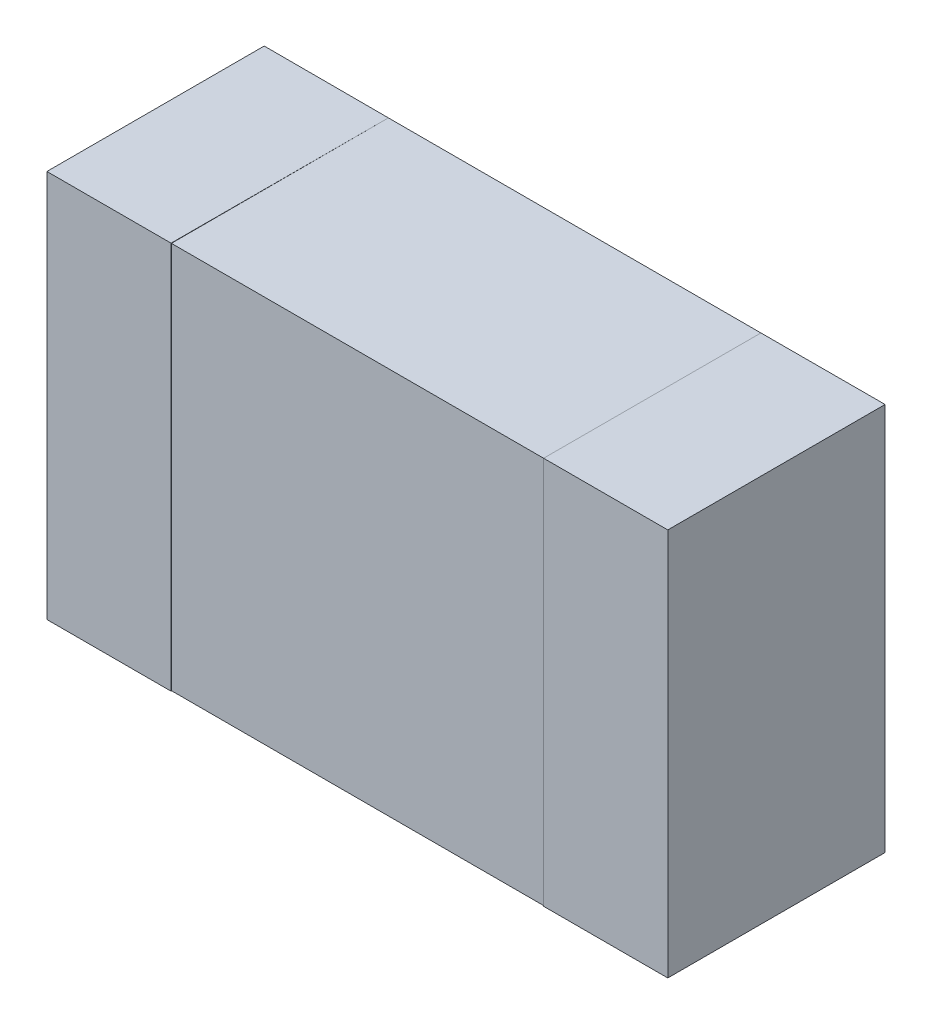
ISO-10303-21;
HEADER;
FILE_DESCRIPTION(('STEP AP214'),'2;1');
FILE_NAME('part.step','',(''),(''),'','','');
FILE_SCHEMA(('AUTOMOTIVE_DESIGN { 1 0 10303 214 1 1 1 1 }'));
ENDSEC;
DATA;
#1=APPLICATION_CONTEXT('core data for automotive mechanical design processes');
#2=APPLICATION_PROTOCOL_DEFINITION('international standard','automotive_design',2000,#1);
#3=PRODUCT_CONTEXT('',#1,'mechanical');
#4=PRODUCT('Part','Part','',(#3));
#5=PRODUCT_RELATED_PRODUCT_CATEGORY('part','',(#4));
#6=PRODUCT_DEFINITION_FORMATION('','',#4);
#7=PRODUCT_DEFINITION_CONTEXT('part definition',#1,'design');
#8=PRODUCT_DEFINITION('design','',#6,#7);
#9=PRODUCT_DEFINITION_SHAPE('','',#8);
#10=(LENGTH_UNIT() NAMED_UNIT(*) SI_UNIT(.MILLI.,.METRE.));
#11=(NAMED_UNIT(*) PLANE_ANGLE_UNIT() SI_UNIT($,.RADIAN.));
#12=(NAMED_UNIT(*) SI_UNIT($,.STERADIAN.) SOLID_ANGLE_UNIT());
#13=UNCERTAINTY_MEASURE_WITH_UNIT(LENGTH_MEASURE(1.E-05),#10,'distance_accuracy_value','');
#14=(GEOMETRIC_REPRESENTATION_CONTEXT(3) GLOBAL_UNCERTAINTY_ASSIGNED_CONTEXT((#13)) GLOBAL_UNIT_ASSIGNED_CONTEXT((#10,
#11,#12)) REPRESENTATION_CONTEXT('',''));
#15=CARTESIAN_POINT('',(0.,0.,0.));
#16=DIRECTION('',(0.,0.,1.));
#17=DIRECTION('',(1.,0.,0.));
#18=AXIS2_PLACEMENT_3D('',#15,#16,#17);
#19=CARTESIAN_POINT('',(0.599,-0.626,0.7));
#20=DIRECTION('',(0.,0.,1.));
#21=DIRECTION('',(1.,0.,0.));
#22=AXIS2_PLACEMENT_3D('',#19,#20,#21);
#23=PLANE('',#22);
#24=DIRECTION('',(0.,-1.,0.));
#25=VECTOR('',#24,1.);
#26=CARTESIAN_POINT('',(1.,0.,0.7));
#27=LINE('',#26,#25);
#28=CARTESIAN_POINT('',(1.,0.625,0.7));
#29=VERTEX_POINT('',#28);
#30=CARTESIAN_POINT('',(1.,-0.625,0.7));
#31=VERTEX_POINT('',#30);
#32=EDGE_CURVE('E179',#29,#31,#27,.T.);
#33=ORIENTED_EDGE('',*,*,#32,.F.);
#34=DIRECTION('',(1.,0.,0.));
#35=VECTOR('',#34,1.);
#36=CARTESIAN_POINT('',(0.8,0.625,0.7));
#37=LINE('',#36,#35);
#38=CARTESIAN_POINT('',(0.6,0.625,0.7));
#39=VERTEX_POINT('',#38);
#40=EDGE_CURVE('E180',#39,#29,#37,.T.);
#41=ORIENTED_EDGE('',*,*,#40,.F.);
#42=DIRECTION('',(0.,1.,0.));
#43=VECTOR('',#42,1.);
#44=CARTESIAN_POINT('',(0.6,-0.626,0.7));
#45=LINE('',#44,#43);
#46=CARTESIAN_POINT('',(0.6,-0.625,0.7));
#47=VERTEX_POINT('',#46);
#48=EDGE_CURVE('E21',#47,#39,#45,.T.);
#49=ORIENTED_EDGE('',*,*,#48,.F.);
#50=DIRECTION('',(-1.,0.,0.));
#51=VECTOR('',#50,1.);
#52=CARTESIAN_POINT('',(0.8,-0.625,0.7));
#53=LINE('',#52,#51);
#54=EDGE_CURVE('E185',#31,#47,#53,.T.);
#55=ORIENTED_EDGE('',*,*,#54,.F.);
#56=EDGE_LOOP('',(#33,#41,#49,#55));
#57=FACE_BOUND('',#56,.T.);
#58=ADVANCED_FACE('F17',(#57),#23,.T.);
#59=CARTESIAN_POINT('',(0.6,-0.626,-0.00100000000000003));
#60=DIRECTION('',(-1.,0.,0.));
#61=DIRECTION('',(0.,0.,1.));
#62=AXIS2_PLACEMENT_3D('',#59,#60,#61);
#63=PLANE('',#62);
#64=DIRECTION('',(0.,0.,-1.));
#65=VECTOR('',#64,1.);
#66=CARTESIAN_POINT('',(0.6,-0.625,0.701));
#67=LINE('',#66,#65);
#68=CARTESIAN_POINT('',(0.6,-0.6245,0.));
#69=VERTEX_POINT('',#68);
#70=EDGE_CURVE('E169',#47,#69,#67,.T.);
#71=ORIENTED_EDGE('',*,*,#70,.F.);
#72=ORIENTED_EDGE('',*,*,#48,.T.);
#73=DIRECTION('',(0.,0.,1.));
#74=VECTOR('',#73,1.);
#75=CARTESIAN_POINT('',(0.6,0.625,-0.00100000000000003));
#76=LINE('',#75,#74);
#77=CARTESIAN_POINT('',(0.6,0.6245,0.));
#78=VERTEX_POINT('',#77);
#79=EDGE_CURVE('E192',#78,#39,#76,.T.);
#80=ORIENTED_EDGE('',*,*,#79,.F.);
#81=DIRECTION('',(0.,0.,1.));
#82=VECTOR('',#81,1.);
#83=CARTESIAN_POINT('',(0.6,0.624,-0.00100000000000003));
#84=LINE('',#83,#82);
#85=CARTESIAN_POINT('',(0.6,0.624,0.699));
#86=VERTEX_POINT('',#85);
#87=EDGE_CURVE('E36',#86,#78,#84,.F.);
#88=ORIENTED_EDGE('',*,*,#87,.F.);
#89=DIRECTION('',(0.,1.,0.));
#90=VECTOR('',#89,1.);
#91=CARTESIAN_POINT('',(0.6,-0.625,0.699));
#92=LINE('',#91,#90);
#93=CARTESIAN_POINT('',(0.6,-0.624,0.699));
#94=VERTEX_POINT('',#93);
#95=EDGE_CURVE('E164',#94,#86,#92,.T.);
#96=ORIENTED_EDGE('',*,*,#95,.F.);
#97=DIRECTION('',(0.,0.,-1.));
#98=VECTOR('',#97,1.);
#99=CARTESIAN_POINT('',(0.6,-0.624,0.7));
#100=LINE('',#99,#98);
#101=EDGE_CURVE('E215',#69,#94,#100,.F.);
#102=ORIENTED_EDGE('',*,*,#101,.F.);
#103=EDGE_LOOP('',(#71,#72,#80,#88,#96,#102));
#104=FACE_BOUND('',#103,.T.);
#105=ADVANCED_FACE('F235',(#104),#63,.T.);
#106=CARTESIAN_POINT('',(0.599,0.625,-0.00100000000000003));
#107=DIRECTION('',(0.,1.,0.));
#108=DIRECTION('',(0.,0.,1.));
#109=AXIS2_PLACEMENT_3D('',#106,#107,#108);
#110=PLANE('',#109);
#111=ORIENTED_EDGE('',*,*,#40,.T.);
#112=DIRECTION('',(0.,0.,1.));
#113=VECTOR('',#112,1.);
#114=CARTESIAN_POINT('',(1.,0.625,0.35));
#115=LINE('',#114,#113);
#116=CARTESIAN_POINT('',(1.,0.625,0.));
#117=VERTEX_POINT('',#116);
#118=EDGE_CURVE('E176',#117,#29,#115,.T.);
#119=ORIENTED_EDGE('',*,*,#118,.F.);
#120=DIRECTION('',(1.,0.,0.));
#121=VECTOR('',#120,1.);
#122=CARTESIAN_POINT('',(0.,0.625,0.));
#123=LINE('',#122,#121);
#124=EDGE_CURVE('E140',#78,#117,#123,.T.);
#125=ORIENTED_EDGE('',*,*,#124,.F.);
#126=ORIENTED_EDGE('',*,*,#79,.T.);
#127=EDGE_LOOP('',(#111,#119,#125,#126));
#128=FACE_BOUND('',#127,.T.);
#129=ADVANCED_FACE('F238',(#128),#110,.T.);
#130=CARTESIAN_POINT('',(1.,-0.626,0.701));
#131=DIRECTION('',(1.,0.,0.));
#132=DIRECTION('',(0.,0.,-1.));
#133=AXIS2_PLACEMENT_3D('',#130,#131,#132);
#134=PLANE('',#133);
#135=ORIENTED_EDGE('',*,*,#32,.T.);
#136=DIRECTION('',(0.,0.,1.));
#137=VECTOR('',#136,1.);
#138=CARTESIAN_POINT('',(1.,-0.625,0.35));
#139=LINE('',#138,#137);
#140=CARTESIAN_POINT('',(1.,-0.625,0.));
#141=VERTEX_POINT('',#140);
#142=EDGE_CURVE('E166',#141,#31,#139,.T.);
#143=ORIENTED_EDGE('',*,*,#142,.F.);
#144=DIRECTION('',(0.,-1.,0.));
#145=VECTOR('',#144,1.);
#146=CARTESIAN_POINT('',(1.,0.,0.));
#147=LINE('',#146,#145);
#148=EDGE_CURVE('E137',#117,#141,#147,.T.);
#149=ORIENTED_EDGE('',*,*,#148,.F.);
#150=ORIENTED_EDGE('',*,*,#118,.T.);
#151=EDGE_LOOP('',(#135,#143,#149,#150));
#152=FACE_BOUND('',#151,.T.);
#153=ADVANCED_FACE('F241',(#152),#134,.T.);
#154=CARTESIAN_POINT('',(0.599,-0.625,0.701));
#155=DIRECTION('',(0.,-1.,0.));
#156=DIRECTION('',(0.,0.,-1.));
#157=AXIS2_PLACEMENT_3D('',#154,#155,#156);
#158=PLANE('',#157);
#159=DIRECTION('',(-1.,0.,0.));
#160=VECTOR('',#159,1.);
#161=CARTESIAN_POINT('',(0.,-0.625,0.));
#162=LINE('',#161,#160);
#163=EDGE_CURVE('E129',#141,#69,#162,.T.);
#164=ORIENTED_EDGE('',*,*,#163,.F.);
#165=ORIENTED_EDGE('',*,*,#142,.T.);
#166=ORIENTED_EDGE('',*,*,#54,.T.);
#167=ORIENTED_EDGE('',*,*,#70,.T.);
#168=EDGE_LOOP('',(#164,#165,#166,#167));
#169=FACE_BOUND('',#168,.T.);
#170=ADVANCED_FACE('F259',(#169),#158,.T.);
#171=CARTESIAN_POINT('',(-0.601,0.624,-0.00100000000000003));
#172=DIRECTION('',(0.,1.,0.));
#173=DIRECTION('',(0.,0.,1.));
#174=AXIS2_PLACEMENT_3D('',#171,#172,#173);
#175=PLANE('',#174);
#176=ORIENTED_EDGE('',*,*,#87,.T.);
#177=DIRECTION('',(1.,0.,0.));
#178=VECTOR('',#177,1.);
#179=CARTESIAN_POINT('',(0.,0.624,0.));
#180=LINE('',#179,#178);
#181=CARTESIAN_POINT('',(-0.6,0.6245,0.));
#182=VERTEX_POINT('',#181);
#183=EDGE_CURVE('E143',#182,#78,#180,.T.);
#184=ORIENTED_EDGE('',*,*,#183,.F.);
#185=DIRECTION('',(0.,0.,-1.));
#186=VECTOR('',#185,1.);
#187=CARTESIAN_POINT('',(-0.6,0.624,0.701));
#188=LINE('',#187,#186);
#189=CARTESIAN_POINT('',(-0.6,0.624,0.699));
#190=VERTEX_POINT('',#189);
#191=EDGE_CURVE('E128',#190,#182,#188,.T.);
#192=ORIENTED_EDGE('',*,*,#191,.F.);
#193=DIRECTION('',(-1.,0.,0.));
#194=VECTOR('',#193,1.);
#195=CARTESIAN_POINT('',(0.,0.624,0.699));
#196=LINE('',#195,#194);
#197=EDGE_CURVE('E161',#86,#190,#196,.T.);
#198=ORIENTED_EDGE('',*,*,#197,.F.);
#199=EDGE_LOOP('',(#176,#184,#192,#198));
#200=FACE_BOUND('',#199,.T.);
#201=ADVANCED_FACE('F247',(#200),#175,.T.);
#202=CARTESIAN_POINT('',(-0.601,-0.624,0.7));
#203=DIRECTION('',(0.,-1.,0.));
#204=DIRECTION('',(0.,0.,-1.));
#205=AXIS2_PLACEMENT_3D('',#202,#203,#204);
#206=PLANE('',#205);
#207=DIRECTION('',(0.,0.,-1.));
#208=VECTOR('',#207,1.);
#209=CARTESIAN_POINT('',(-0.6,-0.624,0.701));
#210=LINE('',#209,#208);
#211=CARTESIAN_POINT('',(-0.6,-0.6245,0.));
#212=VERTEX_POINT('',#211);
#213=CARTESIAN_POINT('',(-0.6,-0.624,0.699));
#214=VERTEX_POINT('',#213);
#215=EDGE_CURVE('E200',#212,#214,#210,.F.);
#216=ORIENTED_EDGE('',*,*,#215,.F.);
#217=DIRECTION('',(-1.,0.,0.));
#218=VECTOR('',#217,1.);
#219=CARTESIAN_POINT('',(0.,-0.624,0.));
#220=LINE('',#219,#218);
#221=EDGE_CURVE('E148',#69,#212,#220,.T.);
#222=ORIENTED_EDGE('',*,*,#221,.F.);
#223=ORIENTED_EDGE('',*,*,#101,.T.);
#224=DIRECTION('',(1.,0.,0.));
#225=VECTOR('',#224,1.);
#226=CARTESIAN_POINT('',(0.,-0.624,0.699));
#227=LINE('',#226,#225);
#228=EDGE_CURVE('E152',#214,#94,#227,.T.);
#229=ORIENTED_EDGE('',*,*,#228,.F.);
#230=EDGE_LOOP('',(#216,#222,#223,#229));
#231=FACE_BOUND('',#230,.T.);
#232=ADVANCED_FACE('F257',(#231),#206,.T.);
#233=CARTESIAN_POINT('',(-0.601,-0.625,0.699));
#234=DIRECTION('',(0.,0.,1.));
#235=DIRECTION('',(1.,0.,0.));
#236=AXIS2_PLACEMENT_3D('',#233,#234,#235);
#237=PLANE('',#236);
#238=DIRECTION('',(0.,1.,0.));
#239=VECTOR('',#238,1.);
#240=CARTESIAN_POINT('',(-0.6,-0.626,0.699));
#241=LINE('',#240,#239);
#242=EDGE_CURVE('E196',#214,#190,#241,.T.);
#243=ORIENTED_EDGE('',*,*,#242,.F.);
#244=ORIENTED_EDGE('',*,*,#228,.T.);
#245=ORIENTED_EDGE('',*,*,#95,.T.);
#246=ORIENTED_EDGE('',*,*,#197,.T.);
#247=EDGE_LOOP('',(#243,#244,#245,#246));
#248=FACE_BOUND('',#247,.T.);
#249=ADVANCED_FACE('F254',(#248),#237,.T.);
#250=CARTESIAN_POINT('',(1.001,-0.626,0.));
#251=DIRECTION('',(0.,0.,-1.));
#252=DIRECTION('',(-1.,0.,0.));
#253=AXIS2_PLACEMENT_3D('',#250,#251,#252);
#254=PLANE('',#253);
#255=ORIENTED_EDGE('',*,*,#148,.T.);
#256=ORIENTED_EDGE('',*,*,#163,.T.);
#257=ORIENTED_EDGE('',*,*,#221,.T.);
#258=DIRECTION('',(1.,0.,0.));
#259=VECTOR('',#258,1.);
#260=CARTESIAN_POINT('',(-0.8,-0.625,0.));
#261=LINE('',#260,#259);
#262=CARTESIAN_POINT('',(-1.,-0.625,0.));
#263=VERTEX_POINT('',#262);
#264=EDGE_CURVE('E125',#263,#212,#261,.T.);
#265=ORIENTED_EDGE('',*,*,#264,.F.);
#266=DIRECTION('',(0.,-1.,0.));
#267=VECTOR('',#266,1.);
#268=CARTESIAN_POINT('',(-1.,0.,0.));
#269=LINE('',#268,#267);
#270=CARTESIAN_POINT('',(-1.,0.625,0.));
#271=VERTEX_POINT('',#270);
#272=EDGE_CURVE('E120',#271,#263,#269,.T.);
#273=ORIENTED_EDGE('',*,*,#272,.F.);
#274=DIRECTION('',(-1.,0.,0.));
#275=VECTOR('',#274,1.);
#276=CARTESIAN_POINT('',(-0.8,0.625,0.));
#277=LINE('',#276,#275);
#278=EDGE_CURVE('E100',#182,#271,#277,.T.);
#279=ORIENTED_EDGE('',*,*,#278,.F.);
#280=ORIENTED_EDGE('',*,*,#183,.T.);
#281=ORIENTED_EDGE('',*,*,#124,.T.);
#282=EDGE_LOOP('',(#255,#256,#257,#265,#273,#279,#280,#281));
#283=FACE_BOUND('',#282,.T.);
#284=ADVANCED_FACE('F244',(#283),#254,.T.);
#285=CARTESIAN_POINT('',(-1.001,-0.625,0.701));
#286=DIRECTION('',(0.,-1.,0.));
#287=DIRECTION('',(0.,0.,-1.));
#288=AXIS2_PLACEMENT_3D('',#285,#286,#287);
#289=PLANE('',#288);
#290=DIRECTION('',(1.,0.,0.));
#291=VECTOR('',#290,1.);
#292=CARTESIAN_POINT('',(-0.8,-0.625,0.7));
#293=LINE('',#292,#291);
#294=CARTESIAN_POINT('',(-1.,-0.625,0.7));
#295=VERTEX_POINT('',#294);
#296=CARTESIAN_POINT('',(-0.6,-0.625,0.7));
#297=VERTEX_POINT('',#296);
#298=EDGE_CURVE('E103',#295,#297,#293,.T.);
#299=ORIENTED_EDGE('',*,*,#298,.F.);
#300=DIRECTION('',(0.,0.,1.));
#301=VECTOR('',#300,1.);
#302=CARTESIAN_POINT('',(-1.,-0.625,0.35));
#303=LINE('',#302,#301);
#304=EDGE_CURVE('E104',#263,#295,#303,.T.);
#305=ORIENTED_EDGE('',*,*,#304,.F.);
#306=ORIENTED_EDGE('',*,*,#264,.T.);
#307=DIRECTION('',(0.,0.,-1.));
#308=VECTOR('',#307,1.);
#309=CARTESIAN_POINT('',(-0.6,-0.625,0.701));
#310=LINE('',#309,#308);
#311=EDGE_CURVE('E202',#297,#212,#310,.T.);
#312=ORIENTED_EDGE('',*,*,#311,.F.);
#313=EDGE_LOOP('',(#299,#305,#306,#312));
#314=FACE_BOUND('',#313,.T.);
#315=ADVANCED_FACE('F280',(#314),#289,.T.);
#316=CARTESIAN_POINT('',(-0.6,-0.626,0.701));
#317=DIRECTION('',(1.,0.,0.));
#318=DIRECTION('',(0.,0.,-1.));
#319=AXIS2_PLACEMENT_3D('',#316,#317,#318);
#320=PLANE('',#319);
#321=ORIENTED_EDGE('',*,*,#215,.T.);
#322=ORIENTED_EDGE('',*,*,#242,.T.);
#323=ORIENTED_EDGE('',*,*,#191,.T.);
#324=DIRECTION('',(0.,0.,1.));
#325=VECTOR('',#324,1.);
#326=CARTESIAN_POINT('',(-0.6,0.625,-0.00100000000000003));
#327=LINE('',#326,#325);
#328=CARTESIAN_POINT('',(-0.6,0.625,0.7));
#329=VERTEX_POINT('',#328);
#330=EDGE_CURVE('E156',#329,#182,#327,.F.);
#331=ORIENTED_EDGE('',*,*,#330,.F.);
#332=DIRECTION('',(0.,1.,0.));
#333=VECTOR('',#332,1.);
#334=CARTESIAN_POINT('',(-0.6,-0.626,0.7));
#335=LINE('',#334,#333);
#336=EDGE_CURVE('E112',#297,#329,#335,.T.);
#337=ORIENTED_EDGE('',*,*,#336,.F.);
#338=ORIENTED_EDGE('',*,*,#311,.T.);
#339=EDGE_LOOP('',(#321,#322,#323,#331,#337,#338));
#340=FACE_BOUND('',#339,.T.);
#341=ADVANCED_FACE('F249',(#340),#320,.T.);
#342=CARTESIAN_POINT('',(-1.001,0.625,-0.00100000000000003));
#343=DIRECTION('',(0.,1.,0.));
#344=DIRECTION('',(0.,0.,1.));
#345=AXIS2_PLACEMENT_3D('',#342,#343,#344);
#346=PLANE('',#345);
#347=ORIENTED_EDGE('',*,*,#278,.T.);
#348=DIRECTION('',(0.,0.,-1.));
#349=VECTOR('',#348,1.);
#350=CARTESIAN_POINT('',(-1.,0.625,0.35));
#351=LINE('',#350,#349);
#352=CARTESIAN_POINT('',(-1.,0.625,0.7));
#353=VERTEX_POINT('',#352);
#354=EDGE_CURVE('E93',#353,#271,#351,.T.);
#355=ORIENTED_EDGE('',*,*,#354,.F.);
#356=DIRECTION('',(-1.,0.,0.));
#357=VECTOR('',#356,1.);
#358=CARTESIAN_POINT('',(-0.8,0.625,0.7));
#359=LINE('',#358,#357);
#360=EDGE_CURVE('E27',#329,#353,#359,.T.);
#361=ORIENTED_EDGE('',*,*,#360,.F.);
#362=ORIENTED_EDGE('',*,*,#330,.T.);
#363=EDGE_LOOP('',(#347,#355,#361,#362));
#364=FACE_BOUND('',#363,.T.);
#365=ADVANCED_FACE('F95',(#364),#346,.T.);
#366=CARTESIAN_POINT('',(-1.,0.626,-0.00100000000000003));
#367=DIRECTION('',(-1.,0.,0.));
#368=DIRECTION('',(0.,-1.,0.));
#369=AXIS2_PLACEMENT_3D('',#366,#367,#368);
#370=PLANE('',#369);
#371=DIRECTION('',(0.,-1.,0.));
#372=VECTOR('',#371,1.);
#373=CARTESIAN_POINT('',(-1.,0.,0.7));
#374=LINE('',#373,#372);
#375=EDGE_CURVE('E11',#353,#295,#374,.T.);
#376=ORIENTED_EDGE('',*,*,#375,.F.);
#377=ORIENTED_EDGE('',*,*,#354,.T.);
#378=ORIENTED_EDGE('',*,*,#272,.T.);
#379=ORIENTED_EDGE('',*,*,#304,.T.);
#380=EDGE_LOOP('',(#376,#377,#378,#379));
#381=FACE_BOUND('',#380,.T.);
#382=ADVANCED_FACE('F107',(#381),#370,.T.);
#383=CARTESIAN_POINT('',(-1.001,-0.626,0.7));
#384=DIRECTION('',(0.,0.,1.));
#385=DIRECTION('',(1.,0.,0.));
#386=AXIS2_PLACEMENT_3D('',#383,#384,#385);
#387=PLANE('',#386);
#388=ORIENTED_EDGE('',*,*,#360,.T.);
#389=ORIENTED_EDGE('',*,*,#375,.T.);
#390=ORIENTED_EDGE('',*,*,#298,.T.);
#391=ORIENTED_EDGE('',*,*,#336,.T.);
#392=EDGE_LOOP('',(#388,#389,#390,#391));
#393=FACE_BOUND('',#392,.T.);
#394=ADVANCED_FACE('F19',(#393),#387,.T.);
#395=CLOSED_SHELL('',(#58,#105,#129,#153,#170,#201,#232,#249,#284,#315,#341,#365,#382,#394));
#396=MANIFOLD_SOLID_BREP('B1',#395);
#397=ADVANCED_BREP_SHAPE_REPRESENTATION('',(#18,#396),#14);
#398=SHAPE_DEFINITION_REPRESENTATION(#9,#397);
ENDSEC;
END-ISO-10303-21;
